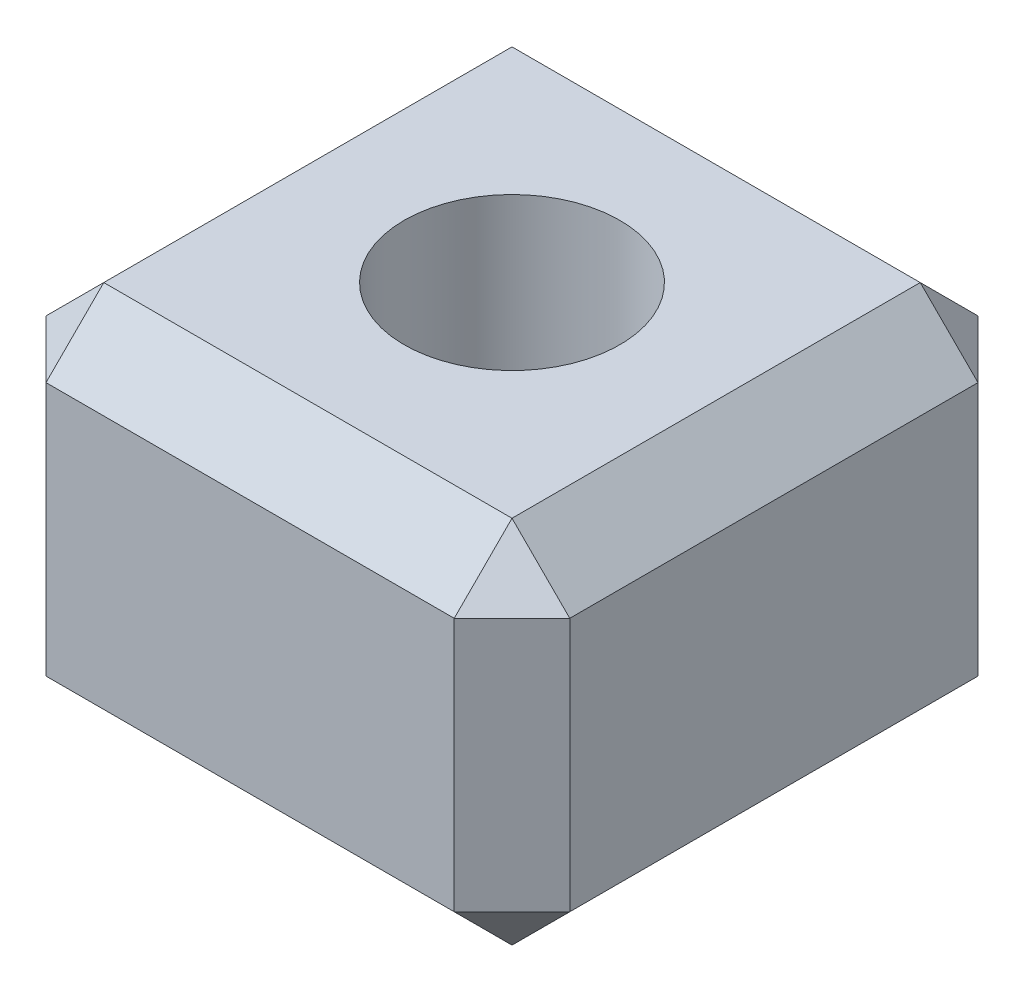
ISO-10303-21;
HEADER;
FILE_DESCRIPTION(('STEP AP214'),'2;1');
FILE_NAME('part.step','',(''),(''),'','','');
FILE_SCHEMA(('AUTOMOTIVE_DESIGN { 1 0 10303 214 1 1 1 1 }'));
ENDSEC;
DATA;
#1=APPLICATION_CONTEXT('core data for automotive mechanical design processes');
#2=APPLICATION_PROTOCOL_DEFINITION('international standard','automotive_design',2000,#1);
#3=PRODUCT_CONTEXT('',#1,'mechanical');
#4=PRODUCT('Part','Part','',(#3));
#5=PRODUCT_RELATED_PRODUCT_CATEGORY('part','',(#4));
#6=PRODUCT_DEFINITION_FORMATION('','',#4);
#7=PRODUCT_DEFINITION_CONTEXT('part definition',#1,'design');
#8=PRODUCT_DEFINITION('design','',#6,#7);
#9=PRODUCT_DEFINITION_SHAPE('','',#8);
#10=(LENGTH_UNIT() NAMED_UNIT(*) SI_UNIT(.MILLI.,.METRE.));
#11=(NAMED_UNIT(*) PLANE_ANGLE_UNIT() SI_UNIT($,.RADIAN.));
#12=(NAMED_UNIT(*) SI_UNIT($,.STERADIAN.) SOLID_ANGLE_UNIT());
#13=UNCERTAINTY_MEASURE_WITH_UNIT(LENGTH_MEASURE(1.E-05),#10,'distance_accuracy_value','');
#14=(GEOMETRIC_REPRESENTATION_CONTEXT(3) GLOBAL_UNCERTAINTY_ASSIGNED_CONTEXT((#13)) GLOBAL_UNIT_ASSIGNED_CONTEXT((#10,
#11,#12)) REPRESENTATION_CONTEXT('',''));
#15=CARTESIAN_POINT('',(0.,0.,0.));
#16=DIRECTION('',(0.,0.,1.));
#17=DIRECTION('',(1.,0.,0.));
#18=AXIS2_PLACEMENT_3D('',#15,#16,#17);
#19=CARTESIAN_POINT('',(0.,-4.80000000000109,0.));
#20=DIRECTION('',(0.,1.,0.));
#21=DIRECTION('',(1.,0.,0.));
#22=AXIS2_PLACEMENT_3D('',#19,#20,#21);
#23=CYLINDRICAL_SURFACE('',#22,2.8);
#24=CARTESIAN_POINT('',(0.,-4.80000000000109,0.));
#25=DIRECTION('',(0.,1.,0.));
#26=DIRECTION('',(1.,0.,0.));
#27=AXIS2_PLACEMENT_3D('',#24,#25,#26);
#28=CIRCLE('',#27,2.8);
#29=CARTESIAN_POINT('',(-2.8,-4.80000000000109,0.));
#30=VERTEX_POINT('',#29);
#31=EDGE_CURVE('E25',#30,#30,#28,.T.);
#32=ORIENTED_EDGE('',*,*,#31,.F.);
#33=DIRECTION('',(0.,1.,0.));
#34=VECTOR('',#33,1.);
#35=CARTESIAN_POINT('',(-2.8,-4.80000000000109,0.));
#36=LINE('',#35,#34);
#37=CARTESIAN_POINT('',(-2.8,4.79999999999891,0.));
#38=VERTEX_POINT('',#37);
#39=EDGE_CURVE('E11',#30,#38,#36,.T.);
#40=ORIENTED_EDGE('',*,*,#39,.T.);
#41=CARTESIAN_POINT('',(0.,4.79999999999891,0.));
#42=DIRECTION('',(0.,-1.,0.));
#43=DIRECTION('',(1.,0.,0.));
#44=AXIS2_PLACEMENT_3D('',#41,#42,#43);
#45=CIRCLE('',#44,2.8);
#46=EDGE_CURVE('E152',#38,#38,#45,.T.);
#47=ORIENTED_EDGE('',*,*,#46,.F.);
#48=ORIENTED_EDGE('',*,*,#39,.F.);
#49=EDGE_LOOP('',(#32,#40,#47,#48));
#50=FACE_BOUND('',#49,.T.);
#51=ADVANCED_FACE('F17',(#50),#23,.F.);
#52=CARTESIAN_POINT('',(6.8,-1.09134923320653E-12,-1.01474384450739E-12));
#53=DIRECTION('',(1.,0.,0.));
#54=DIRECTION('',(0.,1.,0.));
#55=AXIS2_PLACEMENT_3D('',#52,#53,#54);
#56=PLANE('',#55);
#57=DIRECTION('',(0.,0.,1.));
#58=VECTOR('',#57,1.);
#59=CARTESIAN_POINT('',(6.8,-3.30000000000109,3.39999999999899));
#60=LINE('',#59,#58);
#61=CARTESIAN_POINT('',(6.8,-3.30000000000109,-5.30000000000102));
#62=VERTEX_POINT('',#61);
#63=CARTESIAN_POINT('',(6.8,-3.30000000000109,5.29999999999899));
#64=VERTEX_POINT('',#63);
#65=EDGE_CURVE('E317',#62,#64,#60,.T.);
#66=ORIENTED_EDGE('',*,*,#65,.F.);
#67=DIRECTION('',(0.,-1.,0.));
#68=VECTOR('',#67,1.);
#69=CARTESIAN_POINT('',(6.8,-2.40000000000109,-5.30000000000102));
#70=LINE('',#69,#68);
#71=CARTESIAN_POINT('',(6.8,3.29999999999891,-5.30000000000102));
#72=VERTEX_POINT('',#71);
#73=EDGE_CURVE('E153',#72,#62,#70,.T.);
#74=ORIENTED_EDGE('',*,*,#73,.F.);
#75=DIRECTION('',(0.,0.,-1.));
#76=VECTOR('',#75,1.);
#77=CARTESIAN_POINT('',(6.8,3.29999999999891,-3.40000000000102));
#78=LINE('',#77,#76);
#79=CARTESIAN_POINT('',(6.8,3.29999999999891,5.29999999999899));
#80=VERTEX_POINT('',#79);
#81=EDGE_CURVE('E331',#80,#72,#78,.T.);
#82=ORIENTED_EDGE('',*,*,#81,.F.);
#83=DIRECTION('',(0.,1.,0.));
#84=VECTOR('',#83,1.);
#85=CARTESIAN_POINT('',(6.8,2.39999999999891,5.29999999999899));
#86=LINE('',#85,#84);
#87=EDGE_CURVE('E324',#64,#80,#86,.T.);
#88=ORIENTED_EDGE('',*,*,#87,.F.);
#89=EDGE_LOOP('',(#66,#74,#82,#88));
#90=FACE_BOUND('',#89,.T.);
#91=ADVANCED_FACE('F348',(#90),#56,.T.);
#92=CARTESIAN_POINT('',(0.,4.79999999999891,6.79999999999899));
#93=DIRECTION('',(0.,0.,1.));
#94=DIRECTION('',(0.,-1.,0.));
#95=AXIS2_PLACEMENT_3D('',#92,#93,#94);
#96=PLANE('',#95);
#97=DIRECTION('',(-1.,0.,0.));
#98=VECTOR('',#97,1.);
#99=CARTESIAN_POINT('',(0.,-3.30000000000109,6.79999999999899));
#100=LINE('',#99,#98);
#101=CARTESIAN_POINT('',(5.3,-3.30000000000109,6.79999999999899));
#102=VERTEX_POINT('',#101);
#103=CARTESIAN_POINT('',(-5.3,-3.30000000000109,6.79999999999899));
#104=VERTEX_POINT('',#103);
#105=EDGE_CURVE('E245',#102,#104,#100,.T.);
#106=ORIENTED_EDGE('',*,*,#105,.F.);
#107=DIRECTION('',(0.,-1.,0.));
#108=VECTOR('',#107,1.);
#109=CARTESIAN_POINT('',(5.3,2.39999999999891,6.79999999999899));
#110=LINE('',#109,#108);
#111=CARTESIAN_POINT('',(5.3,3.29999999999891,6.79999999999899));
#112=VERTEX_POINT('',#111);
#113=EDGE_CURVE('E328',#112,#102,#110,.T.);
#114=ORIENTED_EDGE('',*,*,#113,.F.);
#115=DIRECTION('',(1.,0.,0.));
#116=VECTOR('',#115,1.);
#117=CARTESIAN_POINT('',(0.,3.29999999999891,6.79999999999899));
#118=LINE('',#117,#116);
#119=CARTESIAN_POINT('',(-5.3,3.29999999999891,6.79999999999899));
#120=VERTEX_POINT('',#119);
#121=EDGE_CURVE('E295',#120,#112,#118,.T.);
#122=ORIENTED_EDGE('',*,*,#121,.F.);
#123=DIRECTION('',(0.,1.,0.));
#124=VECTOR('',#123,1.);
#125=CARTESIAN_POINT('',(-5.3,2.39999999999891,6.79999999999899));
#126=LINE('',#125,#124);
#127=EDGE_CURVE('E199',#104,#120,#126,.T.);
#128=ORIENTED_EDGE('',*,*,#127,.F.);
#129=EDGE_LOOP('',(#106,#114,#122,#128));
#130=FACE_BOUND('',#129,.T.);
#131=ADVANCED_FACE('F354',(#130),#96,.T.);
#132=CARTESIAN_POINT('',(0.,-4.80000000000109,6.79999999999899));
#133=DIRECTION('',(0.,-1.,0.));
#134=DIRECTION('',(-1.,0.,0.));
#135=AXIS2_PLACEMENT_3D('',#132,#133,#134);
#136=PLANE('',#135);
#137=ORIENTED_EDGE('',*,*,#31,.T.);
#138=EDGE_LOOP('',(#137));
#139=FACE_BOUND('',#138,.T.);
#140=DIRECTION('',(1.,0.,0.));
#141=VECTOR('',#140,1.);
#142=CARTESIAN_POINT('',(0.,-4.80000000000109,5.29999999999899));
#143=LINE('',#142,#141);
#144=CARTESIAN_POINT('',(-5.3,-4.80000000000109,5.29999999999899));
#145=VERTEX_POINT('',#144);
#146=CARTESIAN_POINT('',(5.3,-4.80000000000109,5.29999999999899));
#147=VERTEX_POINT('',#146);
#148=EDGE_CURVE('E240',#145,#147,#143,.T.);
#149=ORIENTED_EDGE('',*,*,#148,.F.);
#150=DIRECTION('',(0.,0.,1.));
#151=VECTOR('',#150,1.);
#152=CARTESIAN_POINT('',(-5.3,-4.80000000000109,3.39999999999899));
#153=LINE('',#152,#151);
#154=CARTESIAN_POINT('',(-5.3,-4.80000000000109,-5.30000000000102));
#155=VERTEX_POINT('',#154);
#156=EDGE_CURVE('E198',#155,#145,#153,.T.);
#157=ORIENTED_EDGE('',*,*,#156,.F.);
#158=DIRECTION('',(-1.,0.,0.));
#159=VECTOR('',#158,1.);
#160=CARTESIAN_POINT('',(0.,-4.80000000000109,-5.30000000000102));
#161=LINE('',#160,#159);
#162=CARTESIAN_POINT('',(5.3,-4.80000000000109,-5.30000000000102));
#163=VERTEX_POINT('',#162);
#164=EDGE_CURVE('E273',#163,#155,#161,.T.);
#165=ORIENTED_EDGE('',*,*,#164,.F.);
#166=DIRECTION('',(0.,0.,-1.));
#167=VECTOR('',#166,1.);
#168=CARTESIAN_POINT('',(5.3,-4.80000000000109,3.39999999999899));
#169=LINE('',#168,#167);
#170=EDGE_CURVE('E321',#147,#163,#169,.T.);
#171=ORIENTED_EDGE('',*,*,#170,.F.);
#172=EDGE_LOOP('',(#149,#157,#165,#171));
#173=FACE_BOUND('',#172,.T.);
#174=ADVANCED_FACE('F345',(#139,#173),#136,.T.);
#175=CARTESIAN_POINT('',(-6.8,-1.09134923320653E-12,-1.01474384450739E-12));
#176=DIRECTION('',(-1.,0.,0.));
#177=DIRECTION('',(0.,0.,1.));
#178=AXIS2_PLACEMENT_3D('',#175,#176,#177);
#179=PLANE('',#178);
#180=DIRECTION('',(0.,0.,1.));
#181=VECTOR('',#180,1.);
#182=CARTESIAN_POINT('',(-6.8,3.29999999999891,-3.40000000000102));
#183=LINE('',#182,#181);
#184=CARTESIAN_POINT('',(-6.8,3.29999999999891,-5.30000000000102));
#185=VERTEX_POINT('',#184);
#186=CARTESIAN_POINT('',(-6.8,3.29999999999891,5.29999999999899));
#187=VERTEX_POINT('',#186);
#188=EDGE_CURVE('E270',#185,#187,#183,.T.);
#189=ORIENTED_EDGE('',*,*,#188,.F.);
#190=DIRECTION('',(0.,1.,0.));
#191=VECTOR('',#190,1.);
#192=CARTESIAN_POINT('',(-6.8,-2.40000000000109,-5.30000000000102));
#193=LINE('',#192,#191);
#194=CARTESIAN_POINT('',(-6.8,-3.30000000000109,-5.30000000000102));
#195=VERTEX_POINT('',#194);
#196=EDGE_CURVE('E239',#195,#185,#193,.T.);
#197=ORIENTED_EDGE('',*,*,#196,.F.);
#198=DIRECTION('',(0.,0.,-1.));
#199=VECTOR('',#198,1.);
#200=CARTESIAN_POINT('',(-6.8,-3.30000000000109,3.39999999999899));
#201=LINE('',#200,#199);
#202=CARTESIAN_POINT('',(-6.8,-3.30000000000109,5.29999999999899));
#203=VERTEX_POINT('',#202);
#204=EDGE_CURVE('E195',#203,#195,#201,.T.);
#205=ORIENTED_EDGE('',*,*,#204,.F.);
#206=DIRECTION('',(0.,-1.,0.));
#207=VECTOR('',#206,1.);
#208=CARTESIAN_POINT('',(-6.8,2.39999999999891,5.29999999999899));
#209=LINE('',#208,#207);
#210=EDGE_CURVE('E244',#187,#203,#209,.T.);
#211=ORIENTED_EDGE('',*,*,#210,.F.);
#212=EDGE_LOOP('',(#189,#197,#205,#211));
#213=FACE_BOUND('',#212,.T.);
#214=ADVANCED_FACE('F366',(#213),#179,.T.);
#215=CARTESIAN_POINT('',(0.,4.79999999999891,-6.80000000000102));
#216=DIRECTION('',(0.,1.,0.));
#217=DIRECTION('',(0.,0.,-1.));
#218=AXIS2_PLACEMENT_3D('',#215,#216,#217);
#219=PLANE('',#218);
#220=ORIENTED_EDGE('',*,*,#46,.T.);
#221=EDGE_LOOP('',(#220));
#222=FACE_BOUND('',#221,.T.);
#223=DIRECTION('',(-1.,0.,0.));
#224=VECTOR('',#223,1.);
#225=CARTESIAN_POINT('',(0.,4.79999999999891,5.29999999999899));
#226=LINE('',#225,#224);
#227=CARTESIAN_POINT('',(5.3,4.79999999999891,5.29999999999899));
#228=VERTEX_POINT('',#227);
#229=CARTESIAN_POINT('',(-5.3,4.79999999999891,5.29999999999899));
#230=VERTEX_POINT('',#229);
#231=EDGE_CURVE('E291',#228,#230,#226,.T.);
#232=ORIENTED_EDGE('',*,*,#231,.F.);
#233=DIRECTION('',(0.,0.,1.));
#234=VECTOR('',#233,1.);
#235=CARTESIAN_POINT('',(5.3,4.79999999999891,-3.40000000000102));
#236=LINE('',#235,#234);
#237=CARTESIAN_POINT('',(5.3,4.79999999999891,-5.30000000000102));
#238=VERTEX_POINT('',#237);
#239=EDGE_CURVE('E335',#238,#228,#236,.T.);
#240=ORIENTED_EDGE('',*,*,#239,.F.);
#241=DIRECTION('',(1.,0.,0.));
#242=VECTOR('',#241,1.);
#243=CARTESIAN_POINT('',(0.,4.79999999999891,-5.30000000000102));
#244=LINE('',#243,#242);
#245=CARTESIAN_POINT('',(-5.3,4.79999999999891,-5.30000000000102));
#246=VERTEX_POINT('',#245);
#247=EDGE_CURVE('E165',#246,#238,#244,.T.);
#248=ORIENTED_EDGE('',*,*,#247,.F.);
#249=DIRECTION('',(0.,0.,-1.));
#250=VECTOR('',#249,1.);
#251=CARTESIAN_POINT('',(-5.3,4.79999999999891,-3.40000000000102));
#252=LINE('',#251,#250);
#253=EDGE_CURVE('E206',#230,#246,#252,.T.);
#254=ORIENTED_EDGE('',*,*,#253,.F.);
#255=EDGE_LOOP('',(#232,#240,#248,#254));
#256=FACE_BOUND('',#255,.T.);
#257=ADVANCED_FACE('F369',(#222,#256),#219,.T.);
#258=CARTESIAN_POINT('',(0.,-4.80000000000109,-6.80000000000102));
#259=DIRECTION('',(0.,0.,-1.));
#260=DIRECTION('',(0.,-1.,0.));
#261=AXIS2_PLACEMENT_3D('',#258,#259,#260);
#262=PLANE('',#261);
#263=DIRECTION('',(1.,0.,0.));
#264=VECTOR('',#263,1.);
#265=CARTESIAN_POINT('',(0.,-3.30000000000109,-6.80000000000102));
#266=LINE('',#265,#264);
#267=CARTESIAN_POINT('',(-5.3,-3.30000000000109,-6.80000000000102));
#268=VERTEX_POINT('',#267);
#269=CARTESIAN_POINT('',(5.3,-3.30000000000109,-6.80000000000102));
#270=VERTEX_POINT('',#269);
#271=EDGE_CURVE('E218',#268,#270,#266,.T.);
#272=ORIENTED_EDGE('',*,*,#271,.F.);
#273=DIRECTION('',(0.,-1.,0.));
#274=VECTOR('',#273,1.);
#275=CARTESIAN_POINT('',(-5.3,-2.40000000000109,-6.80000000000102));
#276=LINE('',#275,#274);
#277=CARTESIAN_POINT('',(-5.3,3.29999999999891,-6.80000000000102));
#278=VERTEX_POINT('',#277);
#279=EDGE_CURVE('E159',#278,#268,#276,.T.);
#280=ORIENTED_EDGE('',*,*,#279,.F.);
#281=DIRECTION('',(-1.,0.,0.));
#282=VECTOR('',#281,1.);
#283=CARTESIAN_POINT('',(0.,3.29999999999891,-6.80000000000102));
#284=LINE('',#283,#282);
#285=CARTESIAN_POINT('',(5.3,3.29999999999891,-6.80000000000102));
#286=VERTEX_POINT('',#285);
#287=EDGE_CURVE('E156',#286,#278,#284,.T.);
#288=ORIENTED_EDGE('',*,*,#287,.F.);
#289=DIRECTION('',(0.,1.,0.));
#290=VECTOR('',#289,1.);
#291=CARTESIAN_POINT('',(5.3,-2.40000000000109,-6.80000000000102));
#292=LINE('',#291,#290);
#293=EDGE_CURVE('E140',#270,#286,#292,.T.);
#294=ORIENTED_EDGE('',*,*,#293,.F.);
#295=EDGE_LOOP('',(#272,#280,#288,#294));
#296=FACE_BOUND('',#295,.T.);
#297=ADVANCED_FACE('F158',(#296),#262,.T.);
#298=CARTESIAN_POINT('',(6.05,-2.40000000000109,-6.05000000000102));
#299=DIRECTION('',(0.707106781186548,0.,-0.707106781186548));
#300=DIRECTION('',(0.,-1.,0.));
#301=AXIS2_PLACEMENT_3D('',#298,#299,#300);
#302=PLANE('',#301);
#303=DIRECTION('',(0.707106781186548,0.,0.707106781186548));
#304=VECTOR('',#303,1.);
#305=CARTESIAN_POINT('',(5.3,3.29999999999891,-6.80000000000102));
#306=LINE('',#305,#304);
#307=EDGE_CURVE('E144',#286,#72,#306,.T.);
#308=ORIENTED_EDGE('',*,*,#307,.T.);
#309=ORIENTED_EDGE('',*,*,#73,.T.);
#310=DIRECTION('',(-0.707106781186548,0.,-0.707106781186548));
#311=VECTOR('',#310,1.);
#312=CARTESIAN_POINT('',(6.8,-3.30000000000109,-5.30000000000102));
#313=LINE('',#312,#311);
#314=EDGE_CURVE('E146',#62,#270,#313,.T.);
#315=ORIENTED_EDGE('',*,*,#314,.T.);
#316=ORIENTED_EDGE('',*,*,#293,.T.);
#317=EDGE_LOOP('',(#308,#309,#315,#316));
#318=FACE_BOUND('',#317,.T.);
#319=ADVANCED_FACE('F142',(#318),#302,.T.);
#320=CARTESIAN_POINT('',(6.05,4.04999999999891,-3.40000000000102));
#321=DIRECTION('',(0.707106781186548,0.707106781186547,0.));
#322=DIRECTION('',(0.,0.,-1.));
#323=AXIS2_PLACEMENT_3D('',#320,#321,#322);
#324=PLANE('',#323);
#325=DIRECTION('',(0.707106781186547,-0.707106781186548,0.));
#326=VECTOR('',#325,1.);
#327=CARTESIAN_POINT('',(5.3,4.79999999999891,5.29999999999899));
#328=LINE('',#327,#326);
#329=EDGE_CURVE('E164',#228,#80,#328,.T.);
#330=ORIENTED_EDGE('',*,*,#329,.T.);
#331=ORIENTED_EDGE('',*,*,#81,.T.);
#332=DIRECTION('',(-0.707106781186547,0.707106781186548,0.));
#333=VECTOR('',#332,1.);
#334=CARTESIAN_POINT('',(6.8,3.29999999999891,-5.30000000000102));
#335=LINE('',#334,#333);
#336=EDGE_CURVE('E176',#72,#238,#335,.T.);
#337=ORIENTED_EDGE('',*,*,#336,.T.);
#338=ORIENTED_EDGE('',*,*,#239,.T.);
#339=EDGE_LOOP('',(#330,#331,#337,#338));
#340=FACE_BOUND('',#339,.T.);
#341=ADVANCED_FACE('F370',(#340),#324,.T.);
#342=CARTESIAN_POINT('',(6.05,2.39999999999891,6.04999999999898));
#343=DIRECTION('',(0.707106781186548,0.,0.707106781186548));
#344=DIRECTION('',(0.,-1.,0.));
#345=AXIS2_PLACEMENT_3D('',#342,#343,#344);
#346=PLANE('',#345);
#347=DIRECTION('',(0.707106781186548,0.,-0.707106781186548));
#348=VECTOR('',#347,1.);
#349=CARTESIAN_POINT('',(5.3,-3.30000000000109,6.79999999999899));
#350=LINE('',#349,#348);
#351=EDGE_CURVE('E185',#102,#64,#350,.T.);
#352=ORIENTED_EDGE('',*,*,#351,.T.);
#353=ORIENTED_EDGE('',*,*,#87,.T.);
#354=DIRECTION('',(-0.707106781186548,0.,0.707106781186548));
#355=VECTOR('',#354,1.);
#356=CARTESIAN_POINT('',(6.8,3.29999999999891,5.29999999999899));
#357=LINE('',#356,#355);
#358=EDGE_CURVE('E190',#80,#112,#357,.T.);
#359=ORIENTED_EDGE('',*,*,#358,.T.);
#360=ORIENTED_EDGE('',*,*,#113,.T.);
#361=EDGE_LOOP('',(#352,#353,#359,#360));
#362=FACE_BOUND('',#361,.T.);
#363=ADVANCED_FACE('F373',(#362),#346,.T.);
#364=CARTESIAN_POINT('',(6.05,-4.05000000000109,3.39999999999899));
#365=DIRECTION('',(0.707106781186548,-0.707106781186548,0.));
#366=DIRECTION('',(0.,0.,-1.));
#367=AXIS2_PLACEMENT_3D('',#364,#365,#366);
#368=PLANE('',#367);
#369=DIRECTION('',(0.707106781186548,0.707106781186548,0.));
#370=VECTOR('',#369,1.);
#371=CARTESIAN_POINT('',(5.3,-4.80000000000109,-5.30000000000102));
#372=LINE('',#371,#370);
#373=EDGE_CURVE('E209',#163,#62,#372,.T.);
#374=ORIENTED_EDGE('',*,*,#373,.T.);
#375=ORIENTED_EDGE('',*,*,#65,.T.);
#376=DIRECTION('',(-0.707106781186548,-0.707106781186548,0.));
#377=VECTOR('',#376,1.);
#378=CARTESIAN_POINT('',(6.8,-3.30000000000109,5.29999999999899));
#379=LINE('',#378,#377);
#380=EDGE_CURVE('E255',#64,#147,#379,.T.);
#381=ORIENTED_EDGE('',*,*,#380,.T.);
#382=ORIENTED_EDGE('',*,*,#170,.T.);
#383=EDGE_LOOP('',(#374,#375,#381,#382));
#384=FACE_BOUND('',#383,.T.);
#385=ADVANCED_FACE('F375',(#384),#368,.T.);
#386=CARTESIAN_POINT('',(-6.05,-2.40000000000109,-6.05000000000102));
#387=DIRECTION('',(-0.707106781186548,0.,-0.707106781186548));
#388=DIRECTION('',(-0.707106781186548,0.,0.707106781186548));
#389=AXIS2_PLACEMENT_3D('',#386,#387,#388);
#390=PLANE('',#389);
#391=DIRECTION('',(-0.707106781186548,0.,0.707106781186548));
#392=VECTOR('',#391,1.);
#393=CARTESIAN_POINT('',(-5.3,-3.30000000000109,-6.80000000000102));
#394=LINE('',#393,#392);
#395=EDGE_CURVE('E259',#268,#195,#394,.T.);
#396=ORIENTED_EDGE('',*,*,#395,.T.);
#397=ORIENTED_EDGE('',*,*,#196,.T.);
#398=DIRECTION('',(0.707106781186548,0.,-0.707106781186548));
#399=VECTOR('',#398,1.);
#400=CARTESIAN_POINT('',(-6.8,3.29999999999891,-5.30000000000102));
#401=LINE('',#400,#399);
#402=EDGE_CURVE('E212',#185,#278,#401,.T.);
#403=ORIENTED_EDGE('',*,*,#402,.T.);
#404=ORIENTED_EDGE('',*,*,#279,.T.);
#405=EDGE_LOOP('',(#396,#397,#403,#404));
#406=FACE_BOUND('',#405,.T.);
#407=ADVANCED_FACE('F378',(#406),#390,.T.);
#408=CARTESIAN_POINT('',(-6.05,-4.05000000000109,3.39999999999899));
#409=DIRECTION('',(-0.707106781186548,-0.707106781186548,0.));
#410=DIRECTION('',(-0.707106781186548,0.707106781186548,0.));
#411=AXIS2_PLACEMENT_3D('',#408,#409,#410);
#412=PLANE('',#411);
#413=DIRECTION('',(-0.707106781186548,0.707106781186548,0.));
#414=VECTOR('',#413,1.);
#415=CARTESIAN_POINT('',(-5.3,-4.80000000000109,5.29999999999899));
#416=LINE('',#415,#414);
#417=EDGE_CURVE('E201',#145,#203,#416,.T.);
#418=ORIENTED_EDGE('',*,*,#417,.T.);
#419=ORIENTED_EDGE('',*,*,#204,.T.);
#420=DIRECTION('',(0.707106781186548,-0.707106781186548,0.));
#421=VECTOR('',#420,1.);
#422=CARTESIAN_POINT('',(-6.8,-3.30000000000109,-5.30000000000102));
#423=LINE('',#422,#421);
#424=EDGE_CURVE('E267',#195,#155,#423,.T.);
#425=ORIENTED_EDGE('',*,*,#424,.T.);
#426=ORIENTED_EDGE('',*,*,#156,.T.);
#427=EDGE_LOOP('',(#418,#419,#425,#426));
#428=FACE_BOUND('',#427,.T.);
#429=ADVANCED_FACE('F386',(#428),#412,.T.);
#430=CARTESIAN_POINT('',(-6.05,2.39999999999891,6.04999999999898));
#431=DIRECTION('',(-0.707106781186548,0.,0.707106781186548));
#432=DIRECTION('',(0.,1.,0.));
#433=AXIS2_PLACEMENT_3D('',#430,#431,#432);
#434=PLANE('',#433);
#435=DIRECTION('',(-0.707106781186548,0.,-0.707106781186548));
#436=VECTOR('',#435,1.);
#437=CARTESIAN_POINT('',(-5.3,3.29999999999891,6.79999999999899));
#438=LINE('',#437,#436);
#439=EDGE_CURVE('E213',#120,#187,#438,.T.);
#440=ORIENTED_EDGE('',*,*,#439,.T.);
#441=ORIENTED_EDGE('',*,*,#210,.T.);
#442=DIRECTION('',(0.707106781186548,0.,0.707106781186548));
#443=VECTOR('',#442,1.);
#444=CARTESIAN_POINT('',(-6.8,-3.30000000000109,5.29999999999899));
#445=LINE('',#444,#443);
#446=EDGE_CURVE('E287',#203,#104,#445,.T.);
#447=ORIENTED_EDGE('',*,*,#446,.T.);
#448=ORIENTED_EDGE('',*,*,#127,.T.);
#449=EDGE_LOOP('',(#440,#441,#447,#448));
#450=FACE_BOUND('',#449,.T.);
#451=ADVANCED_FACE('F389',(#450),#434,.T.);
#452=CARTESIAN_POINT('',(0.,-4.05000000000109,6.04999999999899));
#453=DIRECTION('',(0.,-0.707106781186548,0.707106781186547));
#454=DIRECTION('',(-1.,0.,0.));
#455=AXIS2_PLACEMENT_3D('',#452,#453,#454);
#456=PLANE('',#455);
#457=DIRECTION('',(0.,0.707106781186547,0.707106781186548));
#458=VECTOR('',#457,1.);
#459=CARTESIAN_POINT('',(5.3,-4.80000000000109,5.29999999999899));
#460=LINE('',#459,#458);
#461=EDGE_CURVE('E189',#147,#102,#460,.T.);
#462=ORIENTED_EDGE('',*,*,#461,.T.);
#463=ORIENTED_EDGE('',*,*,#105,.T.);
#464=DIRECTION('',(0.,-0.707106781186547,-0.707106781186548));
#465=VECTOR('',#464,1.);
#466=CARTESIAN_POINT('',(-5.3,-3.30000000000109,6.79999999999899));
#467=LINE('',#466,#465);
#468=EDGE_CURVE('E205',#104,#145,#467,.T.);
#469=ORIENTED_EDGE('',*,*,#468,.T.);
#470=ORIENTED_EDGE('',*,*,#148,.T.);
#471=EDGE_LOOP('',(#462,#463,#469,#470));
#472=FACE_BOUND('',#471,.T.);
#473=ADVANCED_FACE('F395',(#472),#456,.T.);
#474=CARTESIAN_POINT('',(-5.3,-3.30000000000109,6.79999999999899));
#475=DIRECTION('',(-0.577350269189626,-0.577350269189626,0.577350269189626));
#476=DIRECTION('',(-0.707106781186548,0.707106781186548,0.));
#477=AXIS2_PLACEMENT_3D('',#474,#475,#476);
#478=PLANE('',#477);
#479=ORIENTED_EDGE('',*,*,#417,.F.);
#480=ORIENTED_EDGE('',*,*,#468,.F.);
#481=ORIENTED_EDGE('',*,*,#446,.F.);
#482=EDGE_LOOP('',(#479,#480,#481));
#483=FACE_BOUND('',#482,.T.);
#484=ADVANCED_FACE('F391',(#483),#478,.T.);
#485=CARTESIAN_POINT('',(-6.05,4.04999999999891,-3.40000000000102));
#486=DIRECTION('',(-0.707106781186548,0.707106781186547,0.));
#487=DIRECTION('',(0.,0.,1.));
#488=AXIS2_PLACEMENT_3D('',#485,#486,#487);
#489=PLANE('',#488);
#490=DIRECTION('',(-0.707106781186547,-0.707106781186548,0.));
#491=VECTOR('',#490,1.);
#492=CARTESIAN_POINT('',(-5.3,4.79999999999891,-5.30000000000102));
#493=LINE('',#492,#491);
#494=EDGE_CURVE('E193',#246,#185,#493,.T.);
#495=ORIENTED_EDGE('',*,*,#494,.T.);
#496=ORIENTED_EDGE('',*,*,#188,.T.);
#497=DIRECTION('',(0.707106781186547,0.707106781186548,0.));
#498=VECTOR('',#497,1.);
#499=CARTESIAN_POINT('',(-6.8,3.29999999999891,5.29999999999899));
#500=LINE('',#499,#498);
#501=EDGE_CURVE('E283',#187,#230,#500,.T.);
#502=ORIENTED_EDGE('',*,*,#501,.T.);
#503=ORIENTED_EDGE('',*,*,#253,.T.);
#504=EDGE_LOOP('',(#495,#496,#502,#503));
#505=FACE_BOUND('',#504,.T.);
#506=ADVANCED_FACE('F394',(#505),#489,.T.);
#507=CARTESIAN_POINT('',(0.,4.04999999999891,6.04999999999898));
#508=DIRECTION('',(0.,0.707106781186548,0.707106781186548));
#509=DIRECTION('',(1.,0.,0.));
#510=AXIS2_PLACEMENT_3D('',#507,#508,#509);
#511=PLANE('',#510);
#512=DIRECTION('',(0.,0.707106781186548,-0.707106781186548));
#513=VECTOR('',#512,1.);
#514=CARTESIAN_POINT('',(5.3,3.29999999999891,6.79999999999899));
#515=LINE('',#514,#513);
#516=EDGE_CURVE('E236',#112,#228,#515,.T.);
#517=ORIENTED_EDGE('',*,*,#516,.T.);
#518=ORIENTED_EDGE('',*,*,#231,.T.);
#519=DIRECTION('',(0.,-0.707106781186548,0.707106781186548));
#520=VECTOR('',#519,1.);
#521=CARTESIAN_POINT('',(-5.3,4.79999999999891,5.29999999999899));
#522=LINE('',#521,#520);
#523=EDGE_CURVE('E217',#230,#120,#522,.T.);
#524=ORIENTED_EDGE('',*,*,#523,.T.);
#525=ORIENTED_EDGE('',*,*,#121,.T.);
#526=EDGE_LOOP('',(#517,#518,#524,#525));
#527=FACE_BOUND('',#526,.T.);
#528=ADVANCED_FACE('F399',(#527),#511,.T.);
#529=CARTESIAN_POINT('',(-5.3,4.79999999999891,5.29999999999899));
#530=DIRECTION('',(-0.577350269189626,0.577350269189626,0.577350269189626));
#531=DIRECTION('',(0.707106781186548,0.,0.707106781186548));
#532=AXIS2_PLACEMENT_3D('',#529,#530,#531);
#533=PLANE('',#532);
#534=ORIENTED_EDGE('',*,*,#439,.F.);
#535=ORIENTED_EDGE('',*,*,#523,.F.);
#536=ORIENTED_EDGE('',*,*,#501,.F.);
#537=EDGE_LOOP('',(#534,#535,#536));
#538=FACE_BOUND('',#537,.T.);
#539=ADVANCED_FACE('F406',(#538),#533,.T.);
#540=CARTESIAN_POINT('',(0.,-4.05000000000109,-6.05000000000102));
#541=DIRECTION('',(0.,-0.707106781186548,-0.707106781186548));
#542=DIRECTION('',(0.,-0.707106781186548,0.707106781186548));
#543=AXIS2_PLACEMENT_3D('',#540,#541,#542);
#544=PLANE('',#543);
#545=DIRECTION('',(0.,-0.707106781186548,0.707106781186548));
#546=VECTOR('',#545,1.);
#547=CARTESIAN_POINT('',(5.3,-3.30000000000109,-6.80000000000102));
#548=LINE('',#547,#546);
#549=EDGE_CURVE('E194',#270,#163,#548,.T.);
#550=ORIENTED_EDGE('',*,*,#549,.T.);
#551=ORIENTED_EDGE('',*,*,#164,.T.);
#552=DIRECTION('',(0.,0.707106781186548,-0.707106781186548));
#553=VECTOR('',#552,1.);
#554=CARTESIAN_POINT('',(-5.3,-4.80000000000109,-5.30000000000102));
#555=LINE('',#554,#553);
#556=EDGE_CURVE('E263',#155,#268,#555,.T.);
#557=ORIENTED_EDGE('',*,*,#556,.T.);
#558=ORIENTED_EDGE('',*,*,#271,.T.);
#559=EDGE_LOOP('',(#550,#551,#557,#558));
#560=FACE_BOUND('',#559,.T.);
#561=ADVANCED_FACE('F413',(#560),#544,.T.);
#562=CARTESIAN_POINT('',(-5.3,-4.80000000000109,-5.30000000000102));
#563=DIRECTION('',(-0.577350269189626,-0.577350269189626,-0.577350269189626));
#564=DIRECTION('',(0.,-0.707106781186548,0.707106781186548));
#565=AXIS2_PLACEMENT_3D('',#562,#563,#564);
#566=PLANE('',#565);
#567=ORIENTED_EDGE('',*,*,#395,.F.);
#568=ORIENTED_EDGE('',*,*,#556,.F.);
#569=ORIENTED_EDGE('',*,*,#424,.F.);
#570=EDGE_LOOP('',(#567,#568,#569));
#571=FACE_BOUND('',#570,.T.);
#572=ADVANCED_FACE('F420',(#571),#566,.T.);
#573=CARTESIAN_POINT('',(5.3,-4.80000000000109,5.29999999999899));
#574=DIRECTION('',(0.577350269189626,-0.577350269189626,0.577350269189625));
#575=DIRECTION('',(0.,-0.707106781186547,-0.707106781186548));
#576=AXIS2_PLACEMENT_3D('',#573,#574,#575);
#577=PLANE('',#576);
#578=ORIENTED_EDGE('',*,*,#351,.F.);
#579=ORIENTED_EDGE('',*,*,#461,.F.);
#580=ORIENTED_EDGE('',*,*,#380,.F.);
#581=EDGE_LOOP('',(#578,#579,#580));
#582=FACE_BOUND('',#581,.T.);
#583=ADVANCED_FACE('F424',(#582),#577,.T.);
#584=CARTESIAN_POINT('',(5.3,3.29999999999891,6.79999999999899));
#585=DIRECTION('',(0.577350269189626,0.577350269189626,0.577350269189626));
#586=DIRECTION('',(0.,0.707106781186548,-0.707106781186548));
#587=AXIS2_PLACEMENT_3D('',#584,#585,#586);
#588=PLANE('',#587);
#589=ORIENTED_EDGE('',*,*,#329,.F.);
#590=ORIENTED_EDGE('',*,*,#516,.F.);
#591=ORIENTED_EDGE('',*,*,#358,.F.);
#592=EDGE_LOOP('',(#589,#590,#591));
#593=FACE_BOUND('',#592,.T.);
#594=ADVANCED_FACE('F430',(#593),#588,.T.);
#595=CARTESIAN_POINT('',(0.,4.04999999999891,-6.05000000000102));
#596=DIRECTION('',(0.,0.707106781186547,-0.707106781186548));
#597=DIRECTION('',(-1.,0.,0.));
#598=AXIS2_PLACEMENT_3D('',#595,#596,#597);
#599=PLANE('',#598);
#600=DIRECTION('',(0.,0.707106781186548,0.707106781186547));
#601=VECTOR('',#600,1.);
#602=CARTESIAN_POINT('',(-5.3,3.29999999999891,-6.80000000000102));
#603=LINE('',#602,#601);
#604=EDGE_CURVE('E221',#278,#246,#603,.T.);
#605=ORIENTED_EDGE('',*,*,#604,.T.);
#606=ORIENTED_EDGE('',*,*,#247,.T.);
#607=DIRECTION('',(0.,-0.707106781186548,-0.707106781186547));
#608=VECTOR('',#607,1.);
#609=CARTESIAN_POINT('',(5.3,4.79999999999891,-5.30000000000102));
#610=LINE('',#609,#608);
#611=EDGE_CURVE('E169',#238,#286,#610,.T.);
#612=ORIENTED_EDGE('',*,*,#611,.T.);
#613=ORIENTED_EDGE('',*,*,#287,.T.);
#614=EDGE_LOOP('',(#605,#606,#612,#613));
#615=FACE_BOUND('',#614,.T.);
#616=ADVANCED_FACE('F170',(#615),#599,.T.);
#617=CARTESIAN_POINT('',(-5.3,3.29999999999891,-6.80000000000102));
#618=DIRECTION('',(-0.577350269189626,0.577350269189626,-0.577350269189626));
#619=DIRECTION('',(-0.707106781186548,0.,0.707106781186548));
#620=AXIS2_PLACEMENT_3D('',#617,#618,#619);
#621=PLANE('',#620);
#622=ORIENTED_EDGE('',*,*,#494,.F.);
#623=ORIENTED_EDGE('',*,*,#604,.F.);
#624=ORIENTED_EDGE('',*,*,#402,.F.);
#625=EDGE_LOOP('',(#622,#623,#624));
#626=FACE_BOUND('',#625,.T.);
#627=ADVANCED_FACE('F437',(#626),#621,.T.);
#628=CARTESIAN_POINT('',(5.3,-3.30000000000109,-6.80000000000102));
#629=DIRECTION('',(0.577350269189626,-0.577350269189626,-0.577350269189626));
#630=DIRECTION('',(0.,-0.707106781186548,0.707106781186548));
#631=AXIS2_PLACEMENT_3D('',#628,#629,#630);
#632=PLANE('',#631);
#633=ORIENTED_EDGE('',*,*,#373,.F.);
#634=ORIENTED_EDGE('',*,*,#549,.F.);
#635=ORIENTED_EDGE('',*,*,#314,.F.);
#636=EDGE_LOOP('',(#633,#634,#635));
#637=FACE_BOUND('',#636,.T.);
#638=ADVANCED_FACE('F440',(#637),#632,.T.);
#639=CARTESIAN_POINT('',(5.3,4.79999999999891,-5.30000000000102));
#640=DIRECTION('',(0.577350269189626,0.577350269189626,-0.577350269189626));
#641=DIRECTION('',(0.,-0.707106781186548,-0.707106781186548));
#642=AXIS2_PLACEMENT_3D('',#639,#640,#641);
#643=PLANE('',#642);
#644=ORIENTED_EDGE('',*,*,#307,.F.);
#645=ORIENTED_EDGE('',*,*,#611,.F.);
#646=ORIENTED_EDGE('',*,*,#336,.F.);
#647=EDGE_LOOP('',(#644,#645,#646));
#648=FACE_BOUND('',#647,.T.);
#649=ADVANCED_FACE('F178',(#648),#643,.T.);
#650=CLOSED_SHELL('',(#51,#91,#131,#174,#214,#257,#297,#319,#341,#363,#385,#407,#429,#451,#473,
#484,#506,#528,#539,#561,#572,#583,#594,#616,#627,#638,#649));
#651=MANIFOLD_SOLID_BREP('B1',#650);
#652=ADVANCED_BREP_SHAPE_REPRESENTATION('',(#18,#651),#14);
#653=SHAPE_DEFINITION_REPRESENTATION(#9,#652);
ENDSEC;
END-ISO-10303-21;
